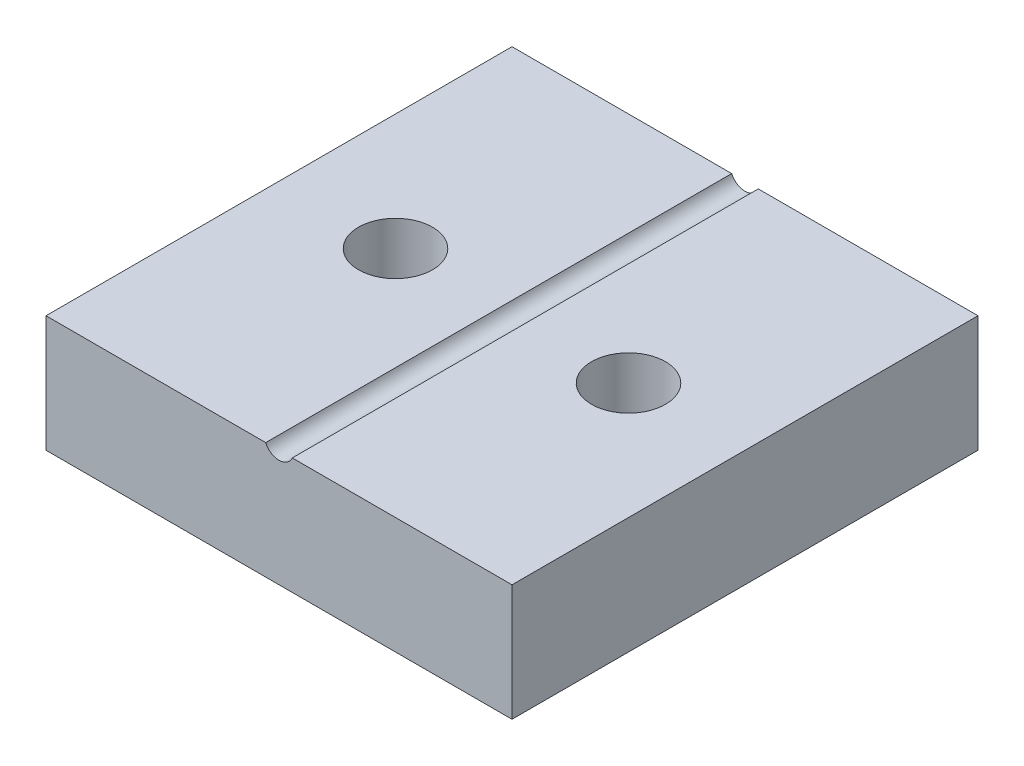
ISO-10303-21;
HEADER;
FILE_DESCRIPTION(('STEP AP214'),'2;1');
FILE_NAME('part.step','',(''),(''),'','','');
FILE_SCHEMA(('AUTOMOTIVE_DESIGN { 1 0 10303 214 1 1 1 1 }'));
ENDSEC;
DATA;
#1=APPLICATION_CONTEXT('core data for automotive mechanical design processes');
#2=APPLICATION_PROTOCOL_DEFINITION('international standard','automotive_design',2000,#1);
#3=PRODUCT_CONTEXT('',#1,'mechanical');
#4=PRODUCT('Part','Part','',(#3));
#5=PRODUCT_RELATED_PRODUCT_CATEGORY('part','',(#4));
#6=PRODUCT_DEFINITION_FORMATION('','',#4);
#7=PRODUCT_DEFINITION_CONTEXT('part definition',#1,'design');
#8=PRODUCT_DEFINITION('design','',#6,#7);
#9=PRODUCT_DEFINITION_SHAPE('','',#8);
#10=(LENGTH_UNIT() NAMED_UNIT(*) SI_UNIT(.MILLI.,.METRE.));
#11=(NAMED_UNIT(*) PLANE_ANGLE_UNIT() SI_UNIT($,.RADIAN.));
#12=(NAMED_UNIT(*) SI_UNIT($,.STERADIAN.) SOLID_ANGLE_UNIT());
#13=UNCERTAINTY_MEASURE_WITH_UNIT(LENGTH_MEASURE(1.E-05),#10,'distance_accuracy_value','');
#14=(GEOMETRIC_REPRESENTATION_CONTEXT(3) GLOBAL_UNCERTAINTY_ASSIGNED_CONTEXT((#13)) GLOBAL_UNIT_ASSIGNED_CONTEXT((#10,
#11,#12)) REPRESENTATION_CONTEXT('',''));
#15=CARTESIAN_POINT('',(0.,0.,0.));
#16=DIRECTION('',(0.,0.,1.));
#17=DIRECTION('',(1.,0.,0.));
#18=AXIS2_PLACEMENT_3D('',#15,#16,#17);
#19=CARTESIAN_POINT('',(0.,5.,0.));
#20=DIRECTION('',(0.,1.,0.));
#21=DIRECTION('',(0.,0.,1.));
#22=AXIS2_PLACEMENT_3D('',#19,#20,#21);
#23=PLANE('',#22);
#24=CARTESIAN_POINT('',(-55.7547169811321,5.,-42.0754716981132));
#25=DIRECTION('',(0.,1.,0.));
#26=DIRECTION('',(0.,0.,1.));
#27=AXIS2_PLACEMENT_3D('',#24,#25,#26);
#28=CIRCLE('',#27,1.5875);
#29=CARTESIAN_POINT('',(-55.7547169811321,5.,-40.4879716981132));
#30=VERTEX_POINT('',#29);
#31=EDGE_CURVE('E171',#30,#30,#28,.T.);
#32=ORIENTED_EDGE('',*,*,#31,.F.);
#33=EDGE_LOOP('',(#32));
#34=FACE_BOUND('',#33,.T.);
#35=DIRECTION('',(0.,0.,1.));
#36=VECTOR('',#35,1.);
#37=CARTESIAN_POINT('',(-51.324591783172,5.,-52.0754716981132));
#38=LINE('',#37,#36);
#39=CARTESIAN_POINT('',(-51.324591783172,5.,-52.0754716981132));
#40=VERTEX_POINT('',#39);
#41=CARTESIAN_POINT('',(-51.324591783172,5.,-32.0754716981132));
#42=VERTEX_POINT('',#41);
#43=EDGE_CURVE('E11',#40,#42,#38,.T.);
#44=ORIENTED_EDGE('',*,*,#43,.F.);
#45=DIRECTION('',(-1.,0.,0.));
#46=VECTOR('',#45,1.);
#47=CARTESIAN_POINT('',(-60.7547169811321,5.,-52.0754716981132));
#48=LINE('',#47,#46);
#49=CARTESIAN_POINT('',(-60.7547169811321,5.,-52.0754716981132));
#50=VERTEX_POINT('',#49);
#51=EDGE_CURVE('E56',#40,#50,#48,.T.);
#52=ORIENTED_EDGE('',*,*,#51,.T.);
#53=DIRECTION('',(0.,0.,1.));
#54=VECTOR('',#53,1.);
#55=CARTESIAN_POINT('',(-60.7547169811321,5.,-52.0754716981132));
#56=LINE('',#55,#54);
#57=CARTESIAN_POINT('',(-60.7547169811321,5.,-32.0754716981132));
#58=VERTEX_POINT('',#57);
#59=EDGE_CURVE('E103',#50,#58,#56,.T.);
#60=ORIENTED_EDGE('',*,*,#59,.T.);
#61=DIRECTION('',(1.,0.,0.));
#62=VECTOR('',#61,1.);
#63=CARTESIAN_POINT('',(-60.7547169811321,5.,-32.0754716981132));
#64=LINE('',#63,#62);
#65=EDGE_CURVE('E85',#58,#42,#64,.T.);
#66=ORIENTED_EDGE('',*,*,#65,.T.);
#67=EDGE_LOOP('',(#44,#52,#60,#66));
#68=FACE_BOUND('',#67,.T.);
#69=ADVANCED_FACE('F33',(#34,#68),#23,.T.);
#70=CARTESIAN_POINT('',(-60.7547169811321,5.,-52.0754716981132));
#71=DIRECTION('',(1.,0.,0.));
#72=DIRECTION('',(0.,0.,-1.));
#73=AXIS2_PLACEMENT_3D('',#70,#71,#72);
#74=PLANE('',#73);
#75=DIRECTION('',(0.,0.,1.));
#76=VECTOR('',#75,1.);
#77=CARTESIAN_POINT('',(-60.7547169811321,0.,-52.0754716981132));
#78=LINE('',#77,#76);
#79=CARTESIAN_POINT('',(-60.7547169811321,0.,-52.0754716981132));
#80=VERTEX_POINT('',#79);
#81=CARTESIAN_POINT('',(-60.7547169811321,0.,-32.0754716981132));
#82=VERTEX_POINT('',#81);
#83=EDGE_CURVE('E114',#80,#82,#78,.T.);
#84=ORIENTED_EDGE('',*,*,#83,.T.);
#85=DIRECTION('',(0.,-1.,0.));
#86=VECTOR('',#85,1.);
#87=CARTESIAN_POINT('',(-60.7547169811321,5.,-32.0754716981132));
#88=LINE('',#87,#86);
#89=EDGE_CURVE('E128',#58,#82,#88,.T.);
#90=ORIENTED_EDGE('',*,*,#89,.F.);
#91=ORIENTED_EDGE('',*,*,#59,.F.);
#92=DIRECTION('',(0.,-1.,0.));
#93=VECTOR('',#92,1.);
#94=CARTESIAN_POINT('',(-60.7547169811321,5.,-52.0754716981132));
#95=LINE('',#94,#93);
#96=EDGE_CURVE('E113',#50,#80,#95,.T.);
#97=ORIENTED_EDGE('',*,*,#96,.T.);
#98=EDGE_LOOP('',(#84,#90,#91,#97));
#99=FACE_BOUND('',#98,.T.);
#100=ADVANCED_FACE('F35',(#99),#74,.F.);
#101=CARTESIAN_POINT('',(-60.7547169811321,5.,-32.0754716981132));
#102=DIRECTION('',(0.,0.,-1.));
#103=DIRECTION('',(-1.,0.,0.));
#104=AXIS2_PLACEMENT_3D('',#101,#102,#103);
#105=PLANE('',#104);
#106=CARTESIAN_POINT('',(-50.1848421790922,5.,-32.0754716981132));
#107=VERTEX_POINT('',#106);
#108=CARTESIAN_POINT('',(-40.7547169811321,5.,-32.0754716981132));
#109=VERTEX_POINT('',#108);
#110=EDGE_CURVE('E99',#107,#109,#64,.T.);
#111=ORIENTED_EDGE('',*,*,#110,.F.);
#112=CARTESIAN_POINT('',(-50.7547169811321,5.25,-32.0754716981132));
#113=DIRECTION('',(0.,0.,1.));
#114=DIRECTION('',(1.,0.,0.));
#115=AXIS2_PLACEMENT_3D('',#112,#113,#114);
#116=CIRCLE('',#115,0.622300000000001);
#117=EDGE_CURVE('E47',#42,#107,#116,.T.);
#118=ORIENTED_EDGE('',*,*,#117,.F.);
#119=ORIENTED_EDGE('',*,*,#65,.F.);
#120=ORIENTED_EDGE('',*,*,#89,.T.);
#121=DIRECTION('',(1.,0.,0.));
#122=VECTOR('',#121,1.);
#123=CARTESIAN_POINT('',(-60.7547169811321,0.,-32.0754716981132));
#124=LINE('',#123,#122);
#125=CARTESIAN_POINT('',(-40.7547169811321,0.,-32.0754716981132));
#126=VERTEX_POINT('',#125);
#127=EDGE_CURVE('E117',#82,#126,#124,.T.);
#128=ORIENTED_EDGE('',*,*,#127,.T.);
#129=DIRECTION('',(0.,-1.,0.));
#130=VECTOR('',#129,1.);
#131=CARTESIAN_POINT('',(-40.7547169811321,5.,-32.0754716981132));
#132=LINE('',#131,#130);
#133=EDGE_CURVE('E125',#109,#126,#132,.T.);
#134=ORIENTED_EDGE('',*,*,#133,.F.);
#135=EDGE_LOOP('',(#111,#118,#119,#120,#128,#134));
#136=FACE_BOUND('',#135,.T.);
#137=ADVANCED_FACE('F97',(#136),#105,.F.);
#138=CARTESIAN_POINT('',(-40.7547169811321,5.,-52.0754716981132));
#139=DIRECTION('',(-1.,0.,0.));
#140=DIRECTION('',(0.,0.,1.));
#141=AXIS2_PLACEMENT_3D('',#138,#139,#140);
#142=PLANE('',#141);
#143=DIRECTION('',(0.,0.,-1.));
#144=VECTOR('',#143,1.);
#145=CARTESIAN_POINT('',(-40.7547169811321,0.,-52.0754716981132));
#146=LINE('',#145,#144);
#147=CARTESIAN_POINT('',(-40.7547169811321,0.,-52.0754716981132));
#148=VERTEX_POINT('',#147);
#149=EDGE_CURVE('E119',#126,#148,#146,.T.);
#150=ORIENTED_EDGE('',*,*,#149,.T.);
#151=DIRECTION('',(0.,-1.,0.));
#152=VECTOR('',#151,1.);
#153=CARTESIAN_POINT('',(-40.7547169811321,5.,-52.0754716981132));
#154=LINE('',#153,#152);
#155=CARTESIAN_POINT('',(-40.7547169811321,5.,-52.0754716981132));
#156=VERTEX_POINT('',#155);
#157=EDGE_CURVE('E123',#156,#148,#154,.T.);
#158=ORIENTED_EDGE('',*,*,#157,.F.);
#159=DIRECTION('',(0.,0.,-1.));
#160=VECTOR('',#159,1.);
#161=CARTESIAN_POINT('',(-40.7547169811321,5.,-52.0754716981132));
#162=LINE('',#161,#160);
#163=EDGE_CURVE('E105',#109,#156,#162,.T.);
#164=ORIENTED_EDGE('',*,*,#163,.F.);
#165=ORIENTED_EDGE('',*,*,#133,.T.);
#166=EDGE_LOOP('',(#150,#158,#164,#165));
#167=FACE_BOUND('',#166,.T.);
#168=ADVANCED_FACE('F137',(#167),#142,.F.);
#169=CARTESIAN_POINT('',(-60.7547169811321,5.,-52.0754716981132));
#170=DIRECTION('',(0.,0.,1.));
#171=DIRECTION('',(1.,0.,0.));
#172=AXIS2_PLACEMENT_3D('',#169,#170,#171);
#173=PLANE('',#172);
#174=ORIENTED_EDGE('',*,*,#51,.F.);
#175=CARTESIAN_POINT('',(-50.7547169811321,5.25,-52.0754716981132));
#176=DIRECTION('',(0.,0.,1.));
#177=DIRECTION('',(1.,0.,0.));
#178=AXIS2_PLACEMENT_3D('',#175,#176,#177);
#179=CIRCLE('',#178,0.622300000000001);
#180=CARTESIAN_POINT('',(-50.1848421790922,5.,-52.0754716981132));
#181=VERTEX_POINT('',#180);
#182=EDGE_CURVE('E95',#40,#181,#179,.T.);
#183=ORIENTED_EDGE('',*,*,#182,.T.);
#184=EDGE_CURVE('E110',#156,#181,#48,.T.);
#185=ORIENTED_EDGE('',*,*,#184,.F.);
#186=ORIENTED_EDGE('',*,*,#157,.T.);
#187=DIRECTION('',(-1.,0.,0.));
#188=VECTOR('',#187,1.);
#189=CARTESIAN_POINT('',(-60.7547169811321,0.,-52.0754716981132));
#190=LINE('',#189,#188);
#191=EDGE_CURVE('E78',#148,#80,#190,.T.);
#192=ORIENTED_EDGE('',*,*,#191,.T.);
#193=ORIENTED_EDGE('',*,*,#96,.F.);
#194=EDGE_LOOP('',(#174,#183,#185,#186,#192,#193));
#195=FACE_BOUND('',#194,.T.);
#196=ADVANCED_FACE('F131',(#195),#173,.F.);
#197=CARTESIAN_POINT('',(-45.7547169811321,5.,-42.0754716981132));
#198=DIRECTION('',(0.,1.,0.));
#199=DIRECTION('',(0.,0.,1.));
#200=AXIS2_PLACEMENT_3D('',#197,#198,#199);
#201=CIRCLE('',#200,1.5875);
#202=CARTESIAN_POINT('',(-45.7547169811321,5.,-40.4879716981132));
#203=VERTEX_POINT('',#202);
#204=EDGE_CURVE('E166',#203,#203,#201,.T.);
#205=ORIENTED_EDGE('',*,*,#204,.F.);
#206=EDGE_LOOP('',(#205));
#207=FACE_BOUND('',#206,.T.);
#208=DIRECTION('',(0.,0.,1.));
#209=VECTOR('',#208,1.);
#210=CARTESIAN_POINT('',(-50.1848421790922,5.,-52.0754716981132));
#211=LINE('',#210,#209);
#212=EDGE_CURVE('E41',#107,#181,#211,.F.);
#213=ORIENTED_EDGE('',*,*,#212,.F.);
#214=ORIENTED_EDGE('',*,*,#110,.T.);
#215=ORIENTED_EDGE('',*,*,#163,.T.);
#216=ORIENTED_EDGE('',*,*,#184,.T.);
#217=EDGE_LOOP('',(#213,#214,#215,#216));
#218=FACE_BOUND('',#217,.T.);
#219=ADVANCED_FACE('F133',(#207,#218),#23,.T.);
#220=CARTESIAN_POINT('',(0.,0.,0.));
#221=DIRECTION('',(0.,1.,0.));
#222=DIRECTION('',(0.,0.,1.));
#223=AXIS2_PLACEMENT_3D('',#220,#221,#222);
#224=PLANE('',#223);
#225=CARTESIAN_POINT('',(-45.7547169811321,0.,-42.0754716981132));
#226=DIRECTION('',(0.,1.,0.));
#227=DIRECTION('',(0.,0.,1.));
#228=AXIS2_PLACEMENT_3D('',#225,#226,#227);
#229=CIRCLE('',#228,1.5875);
#230=CARTESIAN_POINT('',(-45.7547169811321,0.,-40.4879716981132));
#231=VERTEX_POINT('',#230);
#232=EDGE_CURVE('E168',#231,#231,#229,.T.);
#233=ORIENTED_EDGE('',*,*,#232,.T.);
#234=EDGE_LOOP('',(#233));
#235=FACE_BOUND('',#234,.T.);
#236=CARTESIAN_POINT('',(-55.7547169811321,0.,-42.0754716981132));
#237=DIRECTION('',(0.,1.,0.));
#238=DIRECTION('',(0.,0.,1.));
#239=AXIS2_PLACEMENT_3D('',#236,#237,#238);
#240=CIRCLE('',#239,1.5875);
#241=CARTESIAN_POINT('',(-55.7547169811321,0.,-40.4879716981132));
#242=VERTEX_POINT('',#241);
#243=EDGE_CURVE('E100',#242,#242,#240,.T.);
#244=ORIENTED_EDGE('',*,*,#243,.T.);
#245=EDGE_LOOP('',(#244));
#246=FACE_BOUND('',#245,.T.);
#247=ORIENTED_EDGE('',*,*,#83,.F.);
#248=ORIENTED_EDGE('',*,*,#191,.F.);
#249=ORIENTED_EDGE('',*,*,#149,.F.);
#250=ORIENTED_EDGE('',*,*,#127,.F.);
#251=EDGE_LOOP('',(#247,#248,#249,#250));
#252=FACE_BOUND('',#251,.T.);
#253=ADVANCED_FACE('F141',(#235,#246,#252),#224,.F.);
#254=CARTESIAN_POINT('',(-50.7547169811321,5.25,-52.0754716981132));
#255=DIRECTION('',(0.,0.,1.));
#256=DIRECTION('',(1.,0.,0.));
#257=AXIS2_PLACEMENT_3D('',#254,#255,#256);
#258=CYLINDRICAL_SURFACE('',#257,0.622300000000001);
#259=ORIENTED_EDGE('',*,*,#43,.T.);
#260=ORIENTED_EDGE('',*,*,#117,.T.);
#261=ORIENTED_EDGE('',*,*,#212,.T.);
#262=ORIENTED_EDGE('',*,*,#182,.F.);
#263=EDGE_LOOP('',(#259,#260,#261,#262));
#264=FACE_BOUND('',#263,.T.);
#265=ADVANCED_FACE('F93',(#264),#258,.F.);
#266=CARTESIAN_POINT('',(-55.7547169811321,0.,-42.0754716981132));
#267=DIRECTION('',(0.,1.,0.));
#268=DIRECTION('',(0.,0.,1.));
#269=AXIS2_PLACEMENT_3D('',#266,#267,#268);
#270=CYLINDRICAL_SURFACE('',#269,1.5875);
#271=ORIENTED_EDGE('',*,*,#243,.F.);
#272=EDGE_LOOP('',(#271));
#273=FACE_BOUND('',#272,.T.);
#274=ORIENTED_EDGE('',*,*,#31,.T.);
#275=EDGE_LOOP('',(#274));
#276=FACE_BOUND('',#275,.T.);
#277=ADVANCED_FACE('F178',(#273,#276),#270,.F.);
#278=CARTESIAN_POINT('',(-45.7547169811321,0.,-42.0754716981132));
#279=DIRECTION('',(0.,1.,0.));
#280=DIRECTION('',(0.,0.,1.));
#281=AXIS2_PLACEMENT_3D('',#278,#279,#280);
#282=CYLINDRICAL_SURFACE('',#281,1.5875);
#283=ORIENTED_EDGE('',*,*,#232,.F.);
#284=EDGE_LOOP('',(#283));
#285=FACE_BOUND('',#284,.T.);
#286=ORIENTED_EDGE('',*,*,#204,.T.);
#287=EDGE_LOOP('',(#286));
#288=FACE_BOUND('',#287,.T.);
#289=ADVANCED_FACE('F180',(#285,#288),#282,.F.);
#290=CLOSED_SHELL('',(#69,#100,#137,#168,#196,#219,#253,#265,#277,#289));
#291=MANIFOLD_SOLID_BREP('B2',#290);
#292=ADVANCED_BREP_SHAPE_REPRESENTATION('',(#18,#291),#14);
#293=SHAPE_DEFINITION_REPRESENTATION(#9,#292);
ENDSEC;
END-ISO-10303-21;
